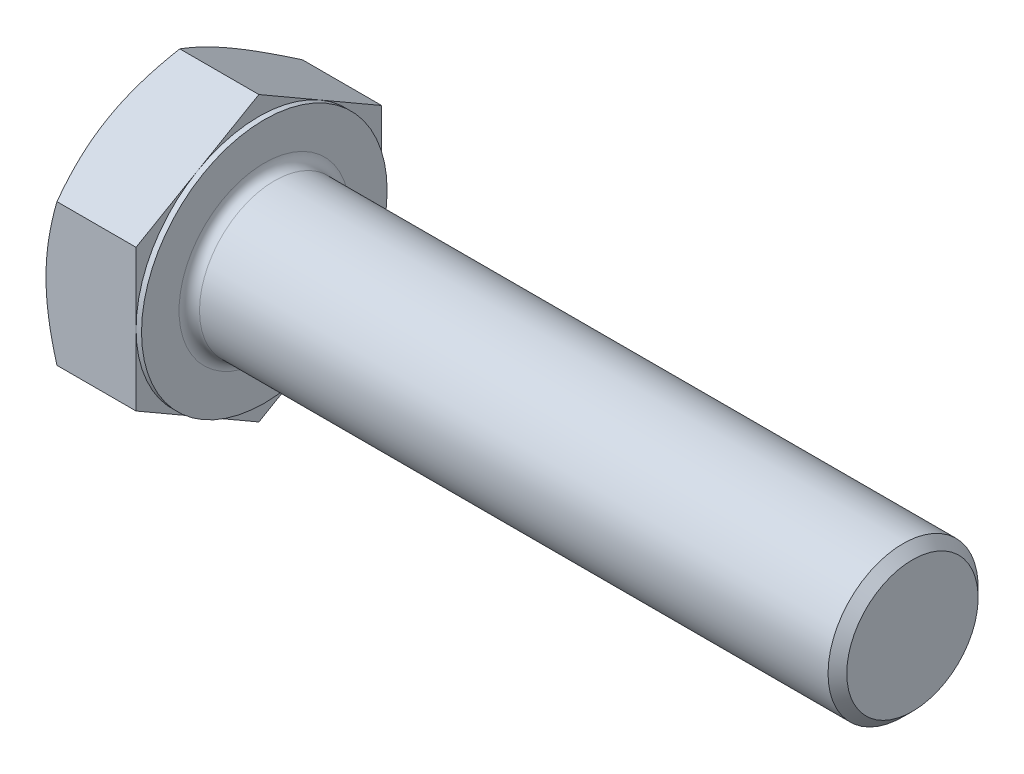
ISO-10303-21;
HEADER;
FILE_DESCRIPTION(('STEP AP214'),'2;1');
FILE_NAME('part.step','',(''),(''),'','','');
FILE_SCHEMA(('AUTOMOTIVE_DESIGN { 1 0 10303 214 1 1 1 1 }'));
ENDSEC;
DATA;
#1=APPLICATION_CONTEXT('core data for automotive mechanical design processes');
#2=APPLICATION_PROTOCOL_DEFINITION('international standard','automotive_design',2000,#1);
#3=PRODUCT_CONTEXT('',#1,'mechanical');
#4=PRODUCT('Part','Part','',(#3));
#5=PRODUCT_RELATED_PRODUCT_CATEGORY('part','',(#4));
#6=PRODUCT_DEFINITION_FORMATION('','',#4);
#7=PRODUCT_DEFINITION_CONTEXT('part definition',#1,'design');
#8=PRODUCT_DEFINITION('design','',#6,#7);
#9=PRODUCT_DEFINITION_SHAPE('','',#8);
#10=(LENGTH_UNIT() NAMED_UNIT(*) SI_UNIT(.MILLI.,.METRE.));
#11=(NAMED_UNIT(*) PLANE_ANGLE_UNIT() SI_UNIT($,.RADIAN.));
#12=(NAMED_UNIT(*) SI_UNIT($,.STERADIAN.) SOLID_ANGLE_UNIT());
#13=UNCERTAINTY_MEASURE_WITH_UNIT(LENGTH_MEASURE(1.E-05),#10,'distance_accuracy_value','');
#14=(GEOMETRIC_REPRESENTATION_CONTEXT(3) GLOBAL_UNCERTAINTY_ASSIGNED_CONTEXT((#13)) GLOBAL_UNIT_ASSIGNED_CONTEXT((#10,
#11,#12)) REPRESENTATION_CONTEXT('',''));
#15=CARTESIAN_POINT('',(0.,0.,0.));
#16=DIRECTION('',(0.,0.,1.));
#17=DIRECTION('',(1.,0.,0.));
#18=AXIS2_PLACEMENT_3D('',#15,#16,#17);
#19=CARTESIAN_POINT('',(14.,20.7846096908265,0.));
#20=DIRECTION('',(1.,0.,0.));
#21=DIRECTION('',(0.,0.,-1.));
#22=AXIS2_PLACEMENT_3D('',#19,#20,#21);
#23=PLANE('',#22);
#24=CARTESIAN_POINT('',(14.,0.,0.));
#25=DIRECTION('',(1.,0.,0.));
#26=DIRECTION('',(0.,0.,-1.));
#27=AXIS2_PLACEMENT_3D('',#24,#25,#26);
#28=CIRCLE('',#27,12.5);
#29=CARTESIAN_POINT('',(14.,0.,-12.5));
#30=VERTEX_POINT('',#29);
#31=EDGE_CURVE('E43',#30,#30,#28,.F.);
#32=ORIENTED_EDGE('',*,*,#31,.T.);
#33=EDGE_LOOP('',(#32));
#34=FACE_BOUND('',#33,.T.);
#35=CARTESIAN_POINT('',(14.,0.,0.));
#36=DIRECTION('',(1.,0.,0.));
#37=DIRECTION('',(0.,0.,-1.));
#38=AXIS2_PLACEMENT_3D('',#35,#36,#37);
#39=CIRCLE('',#38,18.);
#40=CARTESIAN_POINT('',(14.,0.,-18.));
#41=VERTEX_POINT('',#40);
#42=EDGE_CURVE('E294',#41,#41,#39,.T.);
#43=ORIENTED_EDGE('',*,*,#42,.T.);
#44=EDGE_LOOP('',(#43));
#45=FACE_BOUND('',#44,.T.);
#46=ADVANCED_FACE('F35',(#34,#45),#23,.T.);
#47=CARTESIAN_POINT('',(0.,0.,0.));
#48=DIRECTION('',(-1.,0.,0.));
#49=DIRECTION('',(0.,0.,1.));
#50=AXIS2_PLACEMENT_3D('',#47,#48,#49);
#51=CYLINDRICAL_SURFACE('',#50,11.);
#52=CARTESIAN_POINT('',(15.5,0.,0.));
#53=DIRECTION('',(1.,0.,0.));
#54=DIRECTION('',(0.,0.,-1.));
#55=AXIS2_PLACEMENT_3D('',#52,#53,#54);
#56=CIRCLE('',#55,11.);
#57=CARTESIAN_POINT('',(15.5,0.,-11.));
#58=VERTEX_POINT('',#57);
#59=EDGE_CURVE('E11',#58,#58,#56,.T.);
#60=ORIENTED_EDGE('',*,*,#59,.T.);
#61=EDGE_LOOP('',(#60));
#62=FACE_BOUND('',#61,.T.);
#63=CARTESIAN_POINT('',(107.626,0.,0.));
#64=DIRECTION('',(-1.,0.,0.));
#65=DIRECTION('',(0.,0.,1.));
#66=AXIS2_PLACEMENT_3D('',#63,#64,#65);
#67=CIRCLE('',#66,11.);
#68=CARTESIAN_POINT('',(107.626,0.,11.));
#69=VERTEX_POINT('',#68);
#70=EDGE_CURVE('E273',#69,#69,#67,.T.);
#71=ORIENTED_EDGE('',*,*,#70,.T.);
#72=EDGE_LOOP('',(#71));
#73=FACE_BOUND('',#72,.T.);
#74=ADVANCED_FACE('F247',(#62,#73),#51,.T.);
#75=CARTESIAN_POINT('',(109.,0.,0.));
#76=DIRECTION('',(-1.,0.,0.));
#77=DIRECTION('',(0.,0.,1.));
#78=AXIS2_PLACEMENT_3D('',#75,#76,#77);
#79=CONICAL_SURFACE('',#78,9.626,0.785398163397443);
#80=ORIENTED_EDGE('',*,*,#70,.F.);
#81=EDGE_LOOP('',(#80));
#82=FACE_BOUND('',#81,.T.);
#83=CARTESIAN_POINT('',(109.,0.,0.));
#84=DIRECTION('',(-1.,0.,0.));
#85=DIRECTION('',(0.,0.,1.));
#86=AXIS2_PLACEMENT_3D('',#83,#84,#85);
#87=CIRCLE('',#86,9.626);
#88=CARTESIAN_POINT('',(109.,0.,9.626));
#89=VERTEX_POINT('',#88);
#90=EDGE_CURVE('E271',#89,#89,#87,.T.);
#91=ORIENTED_EDGE('',*,*,#90,.T.);
#92=EDGE_LOOP('',(#91));
#93=FACE_BOUND('',#92,.T.);
#94=ADVANCED_FACE('F252',(#82,#93),#79,.T.);
#95=CARTESIAN_POINT('',(109.,0.,0.));
#96=DIRECTION('',(-1.,0.,0.));
#97=DIRECTION('',(0.,0.,1.));
#98=AXIS2_PLACEMENT_3D('',#95,#96,#97);
#99=PLANE('',#98);
#100=ORIENTED_EDGE('',*,*,#90,.F.);
#101=EDGE_LOOP('',(#100));
#102=FACE_BOUND('',#101,.T.);
#103=ADVANCED_FACE('F259',(#102),#99,.F.);
#104=CARTESIAN_POINT('',(13.2,18.,0.));
#105=DIRECTION('',(1.,0.,0.));
#106=DIRECTION('',(0.,0.,-1.));
#107=AXIS2_PLACEMENT_3D('',#104,#105,#106);
#108=PLANE('',#107);
#109=DIRECTION('',(0.,0.500000000000001,0.866025403784438));
#110=VECTOR('',#109,1.);
#111=CARTESIAN_POINT('',(13.2,10.3923048454132,-18.));
#112=LINE('',#111,#110);
#113=CARTESIAN_POINT('',(13.2,10.3923048454132,-18.));
#114=VERTEX_POINT('',#113);
#115=CARTESIAN_POINT('',(13.2,15.5884572681199,-9.00000000000002));
#116=VERTEX_POINT('',#115);
#117=EDGE_CURVE('E167',#114,#116,#112,.T.);
#118=ORIENTED_EDGE('',*,*,#117,.T.);
#119=CARTESIAN_POINT('',(13.2,0.,0.));
#120=DIRECTION('',(-1.,0.,0.));
#121=DIRECTION('',(0.,0.,1.));
#122=AXIS2_PLACEMENT_3D('',#119,#120,#121);
#123=CIRCLE('',#122,18.);
#124=CARTESIAN_POINT('',(13.2,0.,-18.));
#125=VERTEX_POINT('',#124);
#126=EDGE_CURVE('E50',#116,#125,#123,.T.);
#127=ORIENTED_EDGE('',*,*,#126,.T.);
#128=DIRECTION('',(0.,1.,0.));
#129=VECTOR('',#128,1.);
#130=CARTESIAN_POINT('',(13.2,10.3923048454132,-18.));
#131=LINE('',#130,#129);
#132=EDGE_CURVE('E297',#125,#114,#131,.T.);
#133=ORIENTED_EDGE('',*,*,#132,.T.);
#134=EDGE_LOOP('',(#118,#127,#133));
#135=FACE_BOUND('',#134,.T.);
#136=ADVANCED_FACE('F262',(#135),#108,.T.);
#137=CARTESIAN_POINT('',(13.2,20.7846096908265,0.));
#138=VERTEX_POINT('',#137);
#139=EDGE_CURVE('E165',#116,#138,#112,.T.);
#140=ORIENTED_EDGE('',*,*,#139,.T.);
#141=DIRECTION('',(0.,-0.500000000000001,0.866025403784438));
#142=VECTOR('',#141,1.);
#143=CARTESIAN_POINT('',(13.2,20.7846096908265,0.));
#144=LINE('',#143,#142);
#145=CARTESIAN_POINT('',(13.2,15.5884572681199,9.00000000000002));
#146=VERTEX_POINT('',#145);
#147=EDGE_CURVE('E164',#138,#146,#144,.T.);
#148=ORIENTED_EDGE('',*,*,#147,.T.);
#149=EDGE_CURVE('E153',#146,#116,#123,.T.);
#150=ORIENTED_EDGE('',*,*,#149,.T.);
#151=EDGE_LOOP('',(#140,#148,#150));
#152=FACE_BOUND('',#151,.T.);
#153=ADVANCED_FACE('F267',(#152),#108,.T.);
#154=CARTESIAN_POINT('',(13.2,10.3923048454132,18.));
#155=VERTEX_POINT('',#154);
#156=EDGE_CURVE('E132',#146,#155,#144,.T.);
#157=ORIENTED_EDGE('',*,*,#156,.T.);
#158=DIRECTION('',(0.,-1.,0.));
#159=VECTOR('',#158,1.);
#160=CARTESIAN_POINT('',(13.2,10.3923048454132,18.));
#161=LINE('',#160,#159);
#162=CARTESIAN_POINT('',(13.2,0.,18.));
#163=VERTEX_POINT('',#162);
#164=EDGE_CURVE('E126',#155,#163,#161,.T.);
#165=ORIENTED_EDGE('',*,*,#164,.T.);
#166=EDGE_CURVE('E130',#163,#146,#123,.T.);
#167=ORIENTED_EDGE('',*,*,#166,.T.);
#168=EDGE_LOOP('',(#157,#165,#167));
#169=FACE_BOUND('',#168,.T.);
#170=ADVANCED_FACE('F128',(#169),#108,.T.);
#171=CARTESIAN_POINT('',(13.2,-10.3923048454132,18.));
#172=VERTEX_POINT('',#171);
#173=EDGE_CURVE('E136',#163,#172,#161,.T.);
#174=ORIENTED_EDGE('',*,*,#173,.T.);
#175=DIRECTION('',(0.,-0.500000000000002,-0.866025403784438));
#176=VECTOR('',#175,1.);
#177=CARTESIAN_POINT('',(13.2,-20.7846096908265,0.));
#178=LINE('',#177,#176);
#179=CARTESIAN_POINT('',(13.2,-15.5884572681199,9.00000000000004));
#180=VERTEX_POINT('',#179);
#181=EDGE_CURVE('E143',#172,#180,#178,.T.);
#182=ORIENTED_EDGE('',*,*,#181,.T.);
#183=EDGE_CURVE('E140',#180,#163,#123,.T.);
#184=ORIENTED_EDGE('',*,*,#183,.T.);
#185=EDGE_LOOP('',(#174,#182,#184));
#186=FACE_BOUND('',#185,.T.);
#187=ADVANCED_FACE('F141',(#186),#108,.T.);
#188=CARTESIAN_POINT('',(13.2,-20.7846096908265,0.));
#189=VERTEX_POINT('',#188);
#190=EDGE_CURVE('E159',#180,#189,#178,.T.);
#191=ORIENTED_EDGE('',*,*,#190,.T.);
#192=DIRECTION('',(0.,0.499999999999999,-0.866025403784439));
#193=VECTOR('',#192,1.);
#194=CARTESIAN_POINT('',(13.2,-10.3923048454133,-18.));
#195=LINE('',#194,#193);
#196=CARTESIAN_POINT('',(13.2,-15.5884572681199,-8.99999999999999));
#197=VERTEX_POINT('',#196);
#198=EDGE_CURVE('E335',#189,#197,#195,.T.);
#199=ORIENTED_EDGE('',*,*,#198,.T.);
#200=EDGE_CURVE('E147',#197,#180,#123,.T.);
#201=ORIENTED_EDGE('',*,*,#200,.T.);
#202=EDGE_LOOP('',(#191,#199,#201));
#203=FACE_BOUND('',#202,.T.);
#204=ADVANCED_FACE('F336',(#203),#108,.T.);
#205=CARTESIAN_POINT('',(13.2,-10.3923048454133,-18.));
#206=VERTEX_POINT('',#205);
#207=EDGE_CURVE('E154',#197,#206,#195,.T.);
#208=ORIENTED_EDGE('',*,*,#207,.T.);
#209=EDGE_CURVE('E298',#206,#125,#131,.T.);
#210=ORIENTED_EDGE('',*,*,#209,.T.);
#211=EDGE_CURVE('E305',#125,#197,#123,.T.);
#212=ORIENTED_EDGE('',*,*,#211,.T.);
#213=EDGE_LOOP('',(#208,#210,#212));
#214=FACE_BOUND('',#213,.T.);
#215=ADVANCED_FACE('F268',(#214),#108,.T.);
#216=CARTESIAN_POINT('',(0.,0.,0.));
#217=DIRECTION('',(-1.,0.,0.));
#218=DIRECTION('',(0.,0.,1.));
#219=AXIS2_PLACEMENT_3D('',#216,#217,#218);
#220=CYLINDRICAL_SURFACE('',#219,18.);
#221=ORIENTED_EDGE('',*,*,#126,.F.);
#222=ORIENTED_EDGE('',*,*,#149,.F.);
#223=ORIENTED_EDGE('',*,*,#166,.F.);
#224=ORIENTED_EDGE('',*,*,#183,.F.);
#225=ORIENTED_EDGE('',*,*,#200,.F.);
#226=ORIENTED_EDGE('',*,*,#211,.F.);
#227=EDGE_LOOP('',(#221,#222,#223,#224,#225,#226));
#228=FACE_BOUND('',#227,.T.);
#229=ORIENTED_EDGE('',*,*,#42,.F.);
#230=EDGE_LOOP('',(#229));
#231=FACE_BOUND('',#230,.T.);
#232=ADVANCED_FACE('F150',(#228,#231),#220,.T.);
#233=CARTESIAN_POINT('',(0.,20.7846096908265,0.));
#234=DIRECTION('',(1.,0.,0.));
#235=DIRECTION('',(0.,0.,-1.));
#236=AXIS2_PLACEMENT_3D('',#233,#234,#235);
#237=PLANE('',#236);
#238=CARTESIAN_POINT('',(0.,0.,0.));
#239=DIRECTION('',(1.,0.,0.));
#240=DIRECTION('',(0.,0.,-1.));
#241=AXIS2_PLACEMENT_3D('',#238,#239,#240);
#242=CIRCLE('',#241,18.);
#243=CARTESIAN_POINT('',(0.,0.,-18.));
#244=VERTEX_POINT('',#243);
#245=CARTESIAN_POINT('',(0.,15.5884572681199,-9.00000000000002));
#246=VERTEX_POINT('',#245);
#247=EDGE_CURVE('E293',#244,#246,#242,.T.);
#248=ORIENTED_EDGE('',*,*,#247,.F.);
#249=CARTESIAN_POINT('',(0.,-15.5884572681199,-8.99999999999999));
#250=VERTEX_POINT('',#249);
#251=EDGE_CURVE('E289',#250,#244,#242,.T.);
#252=ORIENTED_EDGE('',*,*,#251,.F.);
#253=CARTESIAN_POINT('',(0.,-15.5884572681199,9.00000000000004));
#254=VERTEX_POINT('',#253);
#255=EDGE_CURVE('E292',#254,#250,#242,.T.);
#256=ORIENTED_EDGE('',*,*,#255,.F.);
#257=CARTESIAN_POINT('',(0.,0.,18.));
#258=VERTEX_POINT('',#257);
#259=EDGE_CURVE('E328',#258,#254,#242,.T.);
#260=ORIENTED_EDGE('',*,*,#259,.F.);
#261=CARTESIAN_POINT('',(0.,0.,0.));
#262=DIRECTION('',(-1.,0.,0.));
#263=DIRECTION('',(0.,0.,1.));
#264=AXIS2_PLACEMENT_3D('',#261,#262,#263);
#265=CIRCLE('',#264,18.);
#266=CARTESIAN_POINT('',(0.,15.5884572681199,9.00000000000002));
#267=VERTEX_POINT('',#266);
#268=EDGE_CURVE('E168',#258,#267,#265,.T.);
#269=ORIENTED_EDGE('',*,*,#268,.T.);
#270=EDGE_CURVE('E351',#246,#267,#242,.T.);
#271=ORIENTED_EDGE('',*,*,#270,.F.);
#272=EDGE_LOOP('',(#248,#252,#256,#260,#269,#271));
#273=FACE_BOUND('',#272,.T.);
#274=ADVANCED_FACE('F197',(#273),#237,.F.);
#275=CARTESIAN_POINT('',(0.,0.,0.));
#276=DIRECTION('',(1.,0.,0.));
#277=DIRECTION('',(0.,0.,-1.));
#278=AXIS2_PLACEMENT_3D('',#275,#276,#277);
#279=CONICAL_SURFACE('',#278,18.,1.0471975511966);
#280=CARTESIAN_POINT('',(1.60776182180894,10.3921893753594,18.0002));
#281=CARTESIAN_POINT('',(1.47589336556312,10.6206079566545,17.6045674118041));
#282=CARTESIAN_POINT('',(1.35000889021179,10.8499174930169,17.2073916441644));
#283=CARTESIAN_POINT('',(1.11187123611098,11.310375356009,16.4098552307175));
#284=CARTESIAN_POINT('',(0.999622540659328,11.5415242609305,16.0094935832795));
#285=CARTESIAN_POINT('',(0.790265297583965,12.0061075993295,15.2048116368225));
#286=CARTESIAN_POINT('',(0.693192573141012,12.2395460983593,14.8004842960602));
#287=CARTESIAN_POINT('',(0.516271743787661,12.7080451523823,13.9890201311945));
#288=CARTESIAN_POINT('',(0.436422652420739,12.9431056136839,13.5818834693696));
#289=CARTESIAN_POINT('',(0.297345302854856,13.4088255484441,12.7752328802672));
#290=CARTESIAN_POINT('',(0.237656723113624,13.6394504469968,12.3757788384836));
#291=CARTESIAN_POINT('',(0.137572375669446,14.1017570002651,11.5750403995507));
#292=CARTESIAN_POINT('',(0.0971769793251332,14.3334386752352,11.1737559673198));
#293=CARTESIAN_POINT('',(0.0366989588175625,14.7971912077607,10.3705130188471));
#294=CARTESIAN_POINT('',(0.0165921970388511,15.0292612730516,9.96855587484738));
#295=CARTESIAN_POINT('',(-0.00287614600259025,15.4936156120144,9.16427056704863));
#296=CARTESIAN_POINT('',(-0.00223836829112602,15.7258998788456,8.76194241509822));
#297=CARTESIAN_POINT('',(0.018333579496379,16.1601606713826,8.0097806586889));
#298=CARTESIAN_POINT('',(0.0357591844006479,16.3621681381522,7.65989346273578));
#299=CARTESIAN_POINT('',(0.0859690685012191,16.765701206145,6.96095368643809));
#300=CARTESIAN_POINT('',(0.11875312773627,16.9672268142278,6.61190109421243));
#301=CARTESIAN_POINT('',(0.199111057578682,17.3697198122039,5.91476277202716));
#302=CARTESIAN_POINT('',(0.246698302564828,17.5706865308241,5.56667820474647));
#303=CARTESIAN_POINT('',(0.355822876567441,17.9716632799777,4.87216610255867));
#304=CARTESIAN_POINT('',(0.417360146472634,18.1716733145612,4.52573856063651));
#305=CARTESIAN_POINT('',(0.624462075708563,18.7788295665707,3.47411308402299));
#306=CARTESIAN_POINT('',(0.790677467933146,19.1842175215698,2.77196054918801));
#307=CARTESIAN_POINT('',(1.1679181702988,19.9889486858692,1.37812528618742));
#308=CARTESIAN_POINT('',(1.3788548871277,20.3883021980098,0.686424712978884));
#309=CARTESIAN_POINT('',(1.60776182180895,20.7847251608804,-0.000200000000000849));
#310=B_SPLINE_CURVE_WITH_KNOTS('',3,(#280,#281,#282,#283,#284,#285,#286,#287,#288,#289,#290,
#291,#292,#293,#294,#295,#296,#297,#298,#299,#300,#301,#302,#303,#304,#305,#306,#307,#308,#309),
.UNSPECIFIED.,.F.,.F.,(4,2,2,2,2,2,2,2,2,2,2,2,2,2,4),(0.,1.42650335783821,2.85347447244912,
4.28376471280638,5.71397301377358,7.10888071673008,8.50381526803681,9.8970882864255,
11.2903182514068,12.5031974791544,13.7160593367768,14.9300201888636,16.1439758970578,
18.6253607678546,21.1018751738865),.UNSPECIFIED.);
#311=CARTESIAN_POINT('',(1.60769515458674,20.7846096908265,0.));
#312=VERTEX_POINT('',#311);
#313=EDGE_CURVE('E216',#267,#312,#310,.T.);
#314=ORIENTED_EDGE('',*,*,#313,.T.);
#315=CARTESIAN_POINT('',(1.60776182180895,20.7847251608804,0.0002));
#316=CARTESIAN_POINT('',(1.47589336556313,20.5563065795853,-0.395432588195889));
#317=CARTESIAN_POINT('',(1.3500088902118,20.3269970432229,-0.792608355835561));
#318=CARTESIAN_POINT('',(1.11187123611099,19.8665391802308,-1.59014476928247));
#319=CARTESIAN_POINT('',(0.999622540659336,19.6353902753093,-1.99050641672051));
#320=CARTESIAN_POINT('',(0.790265297583971,19.1708069369103,-2.79518836317755));
#321=CARTESIAN_POINT('',(0.693192573141017,18.9373684378805,-3.19951570393978));
#322=CARTESIAN_POINT('',(0.516271743787666,18.4688693838575,-4.01097986880547));
#323=CARTESIAN_POINT('',(0.436422652420744,18.2338089225559,-4.41811653063042));
#324=CARTESIAN_POINT('',(0.29734530285486,17.7680889877957,-5.22476711973284));
#325=CARTESIAN_POINT('',(0.237656723113627,17.537464089243,-5.62422116151642));
#326=CARTESIAN_POINT('',(0.137572375669448,17.0751575359747,-6.42495960044929));
#327=CARTESIAN_POINT('',(0.0971769793251362,16.8434758610046,-6.82624403268018));
#328=CARTESIAN_POINT('',(0.0366989588175645,16.3797233284791,-7.62948698115295));
#329=CARTESIAN_POINT('',(0.0165921970388512,16.1476532631882,-8.03144412515262));
#330=CARTESIAN_POINT('',(-0.00287614600259242,15.6832989242254,-8.83572943295137));
#331=CARTESIAN_POINT('',(-0.0022383682911285,15.4510146573942,-9.23805758490179));
#332=CARTESIAN_POINT('',(0.0183335794963755,15.0167538648571,-9.99021934131111));
#333=CARTESIAN_POINT('',(0.0357591844006437,14.8147463980876,-10.3401065372642));
#334=CARTESIAN_POINT('',(0.0859690685012138,14.4112133300948,-11.0390463135619));
#335=CARTESIAN_POINT('',(0.118753127736264,14.209687722012,-11.3880989057876));
#336=CARTESIAN_POINT('',(0.199111057578676,13.8071947240359,-12.0852372279728));
#337=CARTESIAN_POINT('',(0.246698302564822,13.6062280054156,-12.4333217952535));
#338=CARTESIAN_POINT('',(0.355822876567433,13.2052512562621,-13.1278338974413));
#339=CARTESIAN_POINT('',(0.417360146472624,13.0052412216786,-13.4742614393635));
#340=CARTESIAN_POINT('',(0.62446207570855,12.3980849696691,-14.525886915977));
#341=CARTESIAN_POINT('',(0.790677467933133,11.99269701467,-15.228039450812));
#342=CARTESIAN_POINT('',(1.16791817029879,11.1879658503706,-16.6218747138126));
#343=CARTESIAN_POINT('',(1.37885488712769,10.78861233823,-17.3135752870211));
#344=CARTESIAN_POINT('',(1.60776182180894,10.3921893753594,-18.0002));
#345=B_SPLINE_CURVE_WITH_KNOTS('',3,(#315,#316,#317,#318,#319,#320,#321,#322,#323,#324,#325,
#326,#327,#328,#329,#330,#331,#332,#333,#334,#335,#336,#337,#338,#339,#340,#341,#342,#343,#344),
.UNSPECIFIED.,.F.,.F.,(4,2,2,2,2,2,2,2,2,2,2,2,2,2,4),(0.,1.42650335783822,2.85347447244913,
4.28376471280638,5.71397301377359,7.10888071673009,8.50381526803682,9.89708828642551,
11.2903182514068,12.5031974791545,13.7160593367768,14.9300201888636,16.1439758970578,
18.6253607678546,21.1018751738864),.UNSPECIFIED.);
#346=EDGE_CURVE('E58',#312,#246,#345,.T.);
#347=ORIENTED_EDGE('',*,*,#346,.T.);
#348=ORIENTED_EDGE('',*,*,#270,.T.);
#349=EDGE_LOOP('',(#314,#347,#348));
#350=FACE_BOUND('',#349,.T.);
#351=ADVANCED_FACE('F352',(#350),#279,.T.);
#352=CARTESIAN_POINT('',(8.808427130496,-27.9643402431046,18.));
#353=CARTESIAN_POINT('',(8.61750677802229,-27.5710662073959,18.));
#354=CARTESIAN_POINT('',(8.42753472732277,-27.1773320233033,18.));
#355=CARTESIAN_POINT('',(8.04970189891834,-26.3888473520457,18.));
#356=CARTESIAN_POINT('',(7.86184114230335,-25.9940968547769,18.));
#357=CARTESIAN_POINT('',(7.30169863346518,-24.8080724634241,18.));
#358=CARTESIAN_POINT('',(6.93291289399546,-24.0151412252697,18.));
#359=CARTESIAN_POINT('',(6.20490967153255,-22.4196974027513,18.));
#360=CARTESIAN_POINT('',(5.84575478283092,-21.6171561882138,18.));
#361=CARTESIAN_POINT('',(5.14207064659813,-20.0057089274192,18.));
#362=CARTESIAN_POINT('',(4.79754071148436,-19.1968031825104,18.));
#363=CARTESIAN_POINT('',(4.11611022257428,-17.5450041866493,18.));
#364=CARTESIAN_POINT('',(3.77981809482908,-16.7018586270337,18.));
#365=CARTESIAN_POINT('',(3.13256514784992,-15.0057154320914,18.));
#366=CARTESIAN_POINT('',(2.82160716489196,-14.1527167058291,18.));
#367=CARTESIAN_POINT('',(2.23315455016407,-12.43711867356,18.));
#368=CARTESIAN_POINT('',(1.95559259436132,-11.5745426460692,18.));
#369=CARTESIAN_POINT('',(1.44279031196762,-9.83693542713533,18.));
#370=CARTESIAN_POINT('',(1.20753670684013,-8.96190823687534,18.));
#371=CARTESIAN_POINT('',(0.895522308058547,-7.64230427801031,18.));
#372=CARTESIAN_POINT('',(0.798539960307994,-7.20248011867894,18.));
#373=CARTESIAN_POINT('',(0.619346663979907,-6.31981731439131,18.));
#374=CARTESIAN_POINT('',(0.537135413912318,-5.87697873115341,18.));
#375=CARTESIAN_POINT('',(0.388933808123908,-4.98859702789481,18.));
#376=CARTESIAN_POINT('',(0.322942911246026,-4.54305399861044,18.));
#377=CARTESIAN_POINT('',(0.208492383577686,-3.64970631100974,18.));
#378=CARTESIAN_POINT('',(0.160032741349874,-3.20190165416907,18.));
#379=CARTESIAN_POINT('',(0.0822220075298154,-2.31054962941569,18.));
#380=CARTESIAN_POINT('',(0.0526283717185093,-1.86702356479735,18.));
#381=CARTESIAN_POINT('',(0.0122265392151963,-0.979118128922007,18.));
#382=CARTESIAN_POINT('',(0.00141802963593451,-0.534738772000965,18.));
#383=CARTESIAN_POINT('',(-0.0011563176208092,0.354079706847762,18.));
#384=CARTESIAN_POINT('',(0.00707792061225407,0.798518829006629,18.));
#385=CARTESIAN_POINT('',(0.0423876675323166,1.68665283494853,18.));
#386=CARTESIAN_POINT('',(0.0694640211301642,2.13034768446279,18.));
#387=CARTESIAN_POINT('',(0.15648209292635,3.19520589070313,18.));
#388=CARTESIAN_POINT('',(0.225281528377598,3.81565824171457,18.));
#389=CARTESIAN_POINT('',(0.395990058380339,5.05199420564999,18.));
#390=CARTESIAN_POINT('',(0.497903614582592,5.66787719147407,18.));
#391=CARTESIAN_POINT('',(0.731215030304269,6.89447554273954,18.));
#392=CARTESIAN_POINT('',(0.862635769426441,7.50518651446563,18.));
#393=CARTESIAN_POINT('',(1.15094813703739,8.72049972355145,18.));
#394=CARTESIAN_POINT('',(1.30783938943284,9.32510205097041,18.));
#395=CARTESIAN_POINT('',(1.64698004778297,10.5414936469055,18.));
#396=CARTESIAN_POINT('',(1.82971241990763,11.1531473228725,18.));
#397=CARTESIAN_POINT('',(2.21414736076856,12.3704299751548,18.));
#398=CARTESIAN_POINT('',(2.41585005430055,12.9760589118076,18.));
#399=CARTESIAN_POINT('',(2.83501520647244,14.18158951787,18.));
#400=CARTESIAN_POINT('',(3.05247247513774,14.7814930003558,18.));
#401=CARTESIAN_POINT('',(3.50057968346487,15.9763233426994,18.));
#402=CARTESIAN_POINT('',(3.73122947137529,16.5712502597116,18.));
#403=CARTESIAN_POINT('',(4.28861115018067,17.9702204857275,18.));
#404=CARTESIAN_POINT('',(4.62002515649326,18.7723954680034,18.));
#405=CARTESIAN_POINT('',(5.29890820133678,20.3699430824084,18.));
#406=CARTESIAN_POINT('',(5.6463782233019,21.1653152943209,18.));
#407=CARTESIAN_POINT('',(6.35417286629494,22.750516727541,18.));
#408=CARTESIAN_POINT('',(6.71450033410772,23.5403446743747,18.));
#409=CARTESIAN_POINT('',(7.44542750445923,25.1152008413773,18.));
#410=CARTESIAN_POINT('',(7.8160269891661,25.9002291628984,18.));
#411=CARTESIAN_POINT('',(8.5659942861388,27.4671332618931,18.));
#412=CARTESIAN_POINT('',(8.94537123353964,28.2490046594181,18.));
#413=CARTESIAN_POINT('',(9.7110079736235,29.8093695492503,18.));
#414=CARTESIAN_POINT('',(10.0972677957068,30.5878630271109,18.));
#415=CARTESIAN_POINT('',(10.8754456131813,32.1418914548454,18.));
#416=CARTESIAN_POINT('',(11.2673628909044,32.9174267644654,18.));
#417=CARTESIAN_POINT('',(12.0559785801666,34.4660583569055,18.));
#418=CARTESIAN_POINT('',(12.4526769828552,35.2391546442373,18.));
#419=CARTESIAN_POINT('',(13.5822142013126,37.4263866617491,18.));
#420=CARTESIAN_POINT('',(14.3197969559458,38.8380724746762,18.));
#421=CARTESIAN_POINT('',(15.8050655327946,41.6561700073893,18.));
#422=CARTESIAN_POINT('',(16.5527517104898,43.0625815393687,18.));
#423=CARTESIAN_POINT('',(18.0539928572742,45.8677641350797,18.));
#424=CARTESIAN_POINT('',(18.8075285851389,47.2665455031668,18.));
#425=CARTESIAN_POINT('',(19.942334530836,49.3622270652889,18.));
#426=CARTESIAN_POINT('',(20.3213432724281,50.0603536788783,18.));
#427=CARTESIAN_POINT('',(21.0807116459902,51.4558704710998,18.));
#428=CARTESIAN_POINT('',(21.4610712758458,52.1532606508822,18.));
#429=CARTESIAN_POINT('',(21.8420286714726,52.850324235841,18.));
#430=B_SPLINE_CURVE_WITH_KNOTS('',3,(#352,#353,#354,#355,#356,#357,#358,#359,#360,#361,#362,
#363,#364,#365,#366,#367,#368,#369,#370,#371,#372,#373,#374,#375,#376,#377,#378,#379,#380,#381,
#382,#383,#384,#385,#386,#387,#388,#389,#390,#391,#392,#393,#394,#395,#396,#397,#398,#399,#400,
#401,#402,#403,#404,#405,#406,#407,#408,#409,#410,#411,#412,#413,#414,#415,#416,#417,#418,#419,
#420,#421,#422,#423,#424,#425,#426,#427,#428,#429),.UNSPECIFIED.,.F.,.F.,(4,2,2,2,2,2,2,2,2,2,2,
2,2,2,2,2,2,2,2,2,2,2,2,2,2,2,2,2,2,2,2,2,2,2,2,2,2,2,4),(0.,1.31149885283058,2.62301079472824,
5.24642021614437,7.88402931842206,10.5215142775822,13.2444150325257,15.9676202112372,
18.6852401997085,21.402005765065,22.7529669019192,24.1039004614305,25.4547889438409,
26.8056765449329,28.1388267463276,29.4719547424042,30.8050880527688,32.138281146834,
34.0100119547707,35.8819950561187,37.7554347199952,39.628846723491,41.5435776020438,
43.4583210774805,45.3724366289069,47.286530166998,49.890113594,52.4938567029427,
55.0981799317037,57.7024479744958,60.3095605480867,62.9166842606505,65.5234801070603,
68.1302711287376,72.908489911859,77.6868772522354,82.4533702914907,84.8364880602421,
87.2196021009334),.UNSPECIFIED.);
#431=CARTESIAN_POINT('',(1.60769515458672,10.3923048454132,18.));
#432=VERTEX_POINT('',#431);
#433=EDGE_CURVE('E228',#258,#432,#430,.T.);
#434=ORIENTED_EDGE('',*,*,#433,.T.);
#435=EDGE_CURVE('E227',#432,#267,#310,.T.);
#436=ORIENTED_EDGE('',*,*,#435,.T.);
#437=ORIENTED_EDGE('',*,*,#268,.F.);
#438=EDGE_LOOP('',(#434,#436,#437));
#439=FACE_BOUND('',#438,.T.);
#440=ADVANCED_FACE('F322',(#439),#279,.T.);
#441=CARTESIAN_POINT('',(1.60769515458671,-10.3923048454132,18.));
#442=VERTEX_POINT('',#441);
#443=EDGE_CURVE('E274',#442,#258,#430,.T.);
#444=ORIENTED_EDGE('',*,*,#443,.T.);
#445=ORIENTED_EDGE('',*,*,#259,.T.);
#446=CARTESIAN_POINT('',(1.60776182180894,-20.7847251608804,-0.000200000000000067));
#447=CARTESIAN_POINT('',(1.47589336556312,-20.5563065795853,0.395432588195888));
#448=CARTESIAN_POINT('',(1.35000889021179,-20.3269970432229,0.792608355835559));
#449=CARTESIAN_POINT('',(1.11187123611097,-19.8665391802308,1.59014476928247));
#450=CARTESIAN_POINT('',(0.999622540659322,-19.6353902753092,1.99050641672051));
#451=CARTESIAN_POINT('',(0.790265297583957,-19.1708069369102,2.79518836317754));
#452=CARTESIAN_POINT('',(0.693192573141003,-18.9373684378804,3.19951570393978));
#453=CARTESIAN_POINT('',(0.516271743787652,-18.4688693838575,4.01097986880546));
#454=CARTESIAN_POINT('',(0.436422652420729,-18.2338089225559,4.41811653063042));
#455=CARTESIAN_POINT('',(0.297345302854844,-17.7680889877956,5.22476711973283));
#456=CARTESIAN_POINT('',(0.237656723113612,-17.537464089243,5.62422116151641));
#457=CARTESIAN_POINT('',(0.137572375669433,-17.0751575359746,6.42495960044928));
#458=CARTESIAN_POINT('',(0.0971769793251206,-16.8434758610045,6.82624403268017));
#459=CARTESIAN_POINT('',(0.0366989588175476,-16.3797233284791,7.62948698115294));
#460=CARTESIAN_POINT('',(0.0165921970388338,-16.1476532631882,8.03144412515261));
#461=CARTESIAN_POINT('',(-0.00287614600260905,-15.6832989242253,8.83572943295136));
#462=CARTESIAN_POINT('',(-0.00223836829114399,-15.4510146573942,9.23805758490177));
#463=CARTESIAN_POINT('',(0.018333579496361,-15.0167538648571,9.99021934131109));
#464=CARTESIAN_POINT('',(0.0357591844006292,-14.8147463980876,10.3401065372642));
#465=CARTESIAN_POINT('',(0.0859690685011982,-14.4112133300948,11.0390463135619));
#466=CARTESIAN_POINT('',(0.118753127736247,-14.209687722012,11.3880989057876));
#467=CARTESIAN_POINT('',(0.199111057578658,-13.8071947240359,12.0852372279728));
#468=CARTESIAN_POINT('',(0.246698302564804,-13.6062280054156,12.4333217952535));
#469=CARTESIAN_POINT('',(0.355822876567417,-13.205251256262,13.1278338974413));
#470=CARTESIAN_POINT('',(0.417360146472609,-13.0052412216786,13.4742614393635));
#471=CARTESIAN_POINT('',(0.624462075708536,-12.3980849696691,14.525886915977));
#472=CARTESIAN_POINT('',(0.790677467933119,-11.9926970146699,15.228039450812));
#473=CARTESIAN_POINT('',(1.16791817029877,-11.1879658503705,16.6218747138126));
#474=CARTESIAN_POINT('',(1.37885488712767,-10.78861233823,17.3135752870211));
#475=CARTESIAN_POINT('',(1.60776182180893,-10.3921893753594,18.0002));
#476=B_SPLINE_CURVE_WITH_KNOTS('',3,(#446,#447,#448,#449,#450,#451,#452,#453,#454,#455,#456,
#457,#458,#459,#460,#461,#462,#463,#464,#465,#466,#467,#468,#469,#470,#471,#472,#473,#474,#475),
.UNSPECIFIED.,.F.,.F.,(4,2,2,2,2,2,2,2,2,2,2,2,2,2,4),(0.,1.42650335783821,2.85347447244913,
4.28376471280638,5.71397301377358,7.10888071673008,8.50381526803681,9.8970882864255,
11.2903182514067,12.5031974791544,13.7160593367768,14.9300201888636,16.1439758970578,
18.6253607678546,21.1018751738865),.UNSPECIFIED.);
#477=EDGE_CURVE('E218',#254,#442,#476,.T.);
#478=ORIENTED_EDGE('',*,*,#477,.T.);
#479=EDGE_LOOP('',(#444,#445,#478));
#480=FACE_BOUND('',#479,.T.);
#481=ADVANCED_FACE('F186',(#480),#279,.T.);
#482=CARTESIAN_POINT('',(1.60769515458672,-20.7846096908265,0.));
#483=VERTEX_POINT('',#482);
#484=EDGE_CURVE('E211',#483,#254,#476,.T.);
#485=ORIENTED_EDGE('',*,*,#484,.T.);
#486=ORIENTED_EDGE('',*,*,#255,.T.);
#487=CARTESIAN_POINT('',(1.60776182180895,-10.3921893753594,-18.0002));
#488=CARTESIAN_POINT('',(1.47589336556313,-10.6206079566545,-17.6045674118041));
#489=CARTESIAN_POINT('',(1.3500088902118,-10.8499174930169,-17.2073916441644));
#490=CARTESIAN_POINT('',(1.11187123611098,-11.310375356009,-16.4098552307175));
#491=CARTESIAN_POINT('',(0.999622540659333,-11.5415242609305,-16.0094935832795));
#492=CARTESIAN_POINT('',(0.790265297583968,-12.0061075993295,-15.2048116368225));
#493=CARTESIAN_POINT('',(0.693192573141014,-12.2395460983593,-14.8004842960602));
#494=CARTESIAN_POINT('',(0.516271743787664,-12.7080451523823,-13.9890201311945));
#495=CARTESIAN_POINT('',(0.436422652420743,-12.9431056136839,-13.5818834693696));
#496=CARTESIAN_POINT('',(0.29734530285486,-13.4088255484441,-12.7752328802672));
#497=CARTESIAN_POINT('',(0.237656723113627,-13.6394504469968,-12.3757788384836));
#498=CARTESIAN_POINT('',(0.137572375669448,-14.1017570002651,-11.5750403995507));
#499=CARTESIAN_POINT('',(0.0971769793251354,-14.3334386752353,-11.1737559673198));
#500=CARTESIAN_POINT('',(0.0366989588175634,-14.7971912077607,-10.370513018847));
#501=CARTESIAN_POINT('',(0.0165921970388502,-15.0292612730516,-9.96855587484736));
#502=CARTESIAN_POINT('',(-0.00287614600259132,-15.4936156120144,-9.16427056704861));
#503=CARTESIAN_POINT('',(-0.00223836829112545,-15.7258998788456,-8.7619424150982));
#504=CARTESIAN_POINT('',(0.0183335794963795,-16.1601606713826,-8.00978065868888));
#505=CARTESIAN_POINT('',(0.0357591844006469,-16.3621681381522,-7.65989346273576));
#506=CARTESIAN_POINT('',(0.0859690685012166,-16.765701206145,-6.96095368643808));
#507=CARTESIAN_POINT('',(0.118753127736267,-16.9672268142278,-6.61190109421241));
#508=CARTESIAN_POINT('',(0.19911105757868,-17.3697198122039,-5.91476277202715));
#509=CARTESIAN_POINT('',(0.246698302564826,-17.5706865308241,-5.56667820474646));
#510=CARTESIAN_POINT('',(0.355822876567437,-17.9716632799777,-4.87216610255866));
#511=CARTESIAN_POINT('',(0.417360146472628,-18.1716733145612,-4.5257385606365));
#512=CARTESIAN_POINT('',(0.624462075708553,-18.7788295665707,-3.47411308402298));
#513=CARTESIAN_POINT('',(0.790677467933135,-19.1842175215698,-2.77196054918801));
#514=CARTESIAN_POINT('',(1.16791817029879,-19.9889486858692,-1.37812528618742));
#515=CARTESIAN_POINT('',(1.37885488712769,-20.3883021980097,-0.686424712978881));
#516=CARTESIAN_POINT('',(1.60776182180894,-20.7847251608804,0.000200000000000986));
#517=B_SPLINE_CURVE_WITH_KNOTS('',3,(#487,#488,#489,#490,#491,#492,#493,#494,#495,#496,#497,
#498,#499,#500,#501,#502,#503,#504,#505,#506,#507,#508,#509,#510,#511,#512,#513,#514,#515,#516),
.UNSPECIFIED.,.F.,.F.,(4,2,2,2,2,2,2,2,2,2,2,2,2,2,4),(0.,1.42650335783821,2.85347447244913,
4.28376471280638,5.71397301377359,7.10888071673009,8.50381526803682,9.89708828642551,
11.2903182514068,12.5031974791544,13.7160593367767,14.9300201888636,16.1439758970578,
18.6253607678546,21.1018751738864),.UNSPECIFIED.);
#518=EDGE_CURVE('E217',#250,#483,#517,.T.);
#519=ORIENTED_EDGE('',*,*,#518,.T.);
#520=EDGE_LOOP('',(#485,#486,#519));
#521=FACE_BOUND('',#520,.T.);
#522=ADVANCED_FACE('F350',(#521),#279,.T.);
#523=CARTESIAN_POINT('',(1.60769515458672,10.3923048454132,-18.));
#524=VERTEX_POINT('',#523);
#525=EDGE_CURVE('E219',#246,#524,#345,.T.);
#526=ORIENTED_EDGE('',*,*,#525,.T.);
#527=CARTESIAN_POINT('',(8.80842713097472,-27.9643402440907,-18.));
#528=CARTESIAN_POINT('',(8.617506778491,-27.5710662083654,-18.));
#529=CARTESIAN_POINT('',(8.42753472778147,-27.1773320242562,-18.));
#530=CARTESIAN_POINT('',(8.04970189935704,-26.3888473529655,-18.));
#531=CARTESIAN_POINT('',(7.86184114273207,-25.9940968556801,-18.));
#532=CARTESIAN_POINT('',(7.30169863386396,-24.8080724642775,-18.));
#533=CARTESIAN_POINT('',(6.93291289437432,-24.0151412260899,-18.));
#534=CARTESIAN_POINT('',(6.20490967187157,-22.4196974035044,-18.));
#535=CARTESIAN_POINT('',(5.84575478315001,-21.6171561889331,-18.));
#536=CARTESIAN_POINT('',(5.14207064687771,-20.0057089280707,-18.));
#537=CARTESIAN_POINT('',(4.79754071174434,-19.196803183128,-18.));
#538=CARTESIAN_POINT('',(4.11611022279456,-17.5450041871963,-18.));
#539=CARTESIAN_POINT('',(3.7798180950293,-16.7018586275441,-18.));
#540=CARTESIAN_POINT('',(3.1325651480111,-15.005715432528,-18.));
#541=CARTESIAN_POINT('',(2.82160716503417,-14.1527167062286,-18.));
#542=CARTESIAN_POINT('',(2.23315455027017,-12.4371186738844,-18.));
#543=CARTESIAN_POINT('',(1.95559259445028,-11.5745426463558,-18.));
#544=CARTESIAN_POINT('',(1.44279031202514,-9.83693542734509,-18.));
#545=CARTESIAN_POINT('',(1.20753670688334,-8.96190823704618,-18.));
#546=CARTESIAN_POINT('',(0.895522308081283,-7.64230427811238,-18.));
#547=CARTESIAN_POINT('',(0.798539960323231,-7.20248011875152,-18.));
#548=CARTESIAN_POINT('',(0.619346663982092,-6.31981731440451,-18.));
#549=CARTESIAN_POINT('',(0.537135413908951,-5.87697873113672,-18.));
#550=CARTESIAN_POINT('',(0.388933808111682,-4.98859702781801,-18.));
#551=CARTESIAN_POINT('',(0.322942911230492,-4.54305399850342,-18.));
#552=CARTESIAN_POINT('',(0.208492383558027,-3.64970631084203,-18.));
#553=CARTESIAN_POINT('',(0.160032741329398,-3.2019016539709,-18.));
#554=CARTESIAN_POINT('',(0.0822220075103916,-2.31054962915723,-18.));
#555=CARTESIAN_POINT('',(0.0526283717009056,-1.86702356450905,-18.));
#556=CARTESIAN_POINT('',(0.0122265392038543,-0.97911812857412,-18.));
#557=CARTESIAN_POINT('',(0.0014180296290341,-0.53473877162332,-18.));
#558=CARTESIAN_POINT('',(-0.00115631761627054,0.354079707284696,-18.));
#559=CARTESIAN_POINT('',(0.00707792062379084,0.798518829473092,-18.));
#560=CARTESIAN_POINT('',(0.0423876675602103,1.68665283547366,-18.));
#561=CARTESIAN_POINT('',(0.0694640211674167,2.13034768501705,-18.));
#562=CARTESIAN_POINT('',(0.15648209298664,3.19520589130288,-18.));
#563=CARTESIAN_POINT('',(0.225281528451189,3.81565824233053,-18.));
#564=CARTESIAN_POINT('',(0.395990058481243,5.05199420629766,-18.));
#565=CARTESIAN_POINT('',(0.497903614697507,5.66787719213723,-18.));
#566=CARTESIAN_POINT('',(0.731215030447435,6.89447554343314,-18.));
#567=CARTESIAN_POINT('',(0.862635769583848,7.50518651517417,-18.));
#568=CARTESIAN_POINT('',(1.15094813722315,8.72049972428945,-18.));
#569=CARTESIAN_POINT('',(1.30783938963271,9.32510205172292,-18.));
#570=CARTESIAN_POINT('',(1.64698004801114,10.5414936476874,-18.));
#571=CARTESIAN_POINT('',(1.82971242014998,11.1531473236693,-18.));
#572=CARTESIAN_POINT('',(2.21414736103885,12.3704299759813,-18.));
#573=CARTESIAN_POINT('',(2.4158500545846,12.9760589126488,-18.));
#574=CARTESIAN_POINT('',(2.83501520678354,14.1815895187405,-18.));
#575=CARTESIAN_POINT('',(3.05247247546212,14.7814930012409,-18.));
#576=CARTESIAN_POINT('',(3.50057968381538,15.9763233436138,-18.));
#577=CARTESIAN_POINT('',(3.73122947173863,16.5712502606406,-18.));
#578=CARTESIAN_POINT('',(4.2886111505641,17.9702204866666,-18.));
#579=CARTESIAN_POINT('',(4.62002515688315,18.7723954689383,-18.));
#580=CARTESIAN_POINT('',(5.29890820173806,20.3699430833352,-18.));
#581=CARTESIAN_POINT('',(5.64637822370813,21.1653152952441,-18.));
#582=CARTESIAN_POINT('',(6.35417286670989,22.750516728457,-18.));
#583=CARTESIAN_POINT('',(6.71450033452645,23.5403446752873,-18.));
#584=CARTESIAN_POINT('',(7.44542750488466,25.1152008422835,-18.));
#585=CARTESIAN_POINT('',(7.81602698959444,25.9002291638016,-18.));
#586=CARTESIAN_POINT('',(8.56599428657223,27.4671332627904,-18.));
#587=CARTESIAN_POINT('',(8.94537123397525,28.2490046603126,-18.));
#588=CARTESIAN_POINT('',(9.71100797406293,29.8093695501392,-18.));
#589=CARTESIAN_POINT('',(10.0972677961478,30.5878630279972,-18.));
#590=CARTESIAN_POINT('',(10.8754456136253,32.1418914557266,-18.));
#591=CARTESIAN_POINT('',(11.2673628913496,32.9174267653441,-18.));
#592=CARTESIAN_POINT('',(12.0559785806139,34.4660583577795,-18.));
#593=CARTESIAN_POINT('',(12.4526769833034,35.239154645109,-18.));
#594=CARTESIAN_POINT('',(13.5822142017646,37.4263866626177,-18.));
#595=CARTESIAN_POINT('',(14.3197969564005,38.8380724755441,-18.));
#596=CARTESIAN_POINT('',(15.805065533254,41.656170008256,-18.));
#597=CARTESIAN_POINT('',(16.5527517109513,43.062581540235,-18.));
#598=CARTESIAN_POINT('',(18.0539928577398,45.8677641359459,-18.));
#599=CARTESIAN_POINT('',(18.8075285856065,47.2665455040333,-18.));
#600=CARTESIAN_POINT('',(19.9423345313063,49.362227066156,-18.));
#601=CARTESIAN_POINT('',(20.3213432728994,50.0603536797456,-18.));
#602=CARTESIAN_POINT('',(21.0807116464631,51.4558704719676,-18.));
#603=CARTESIAN_POINT('',(21.4610712763196,52.1532606517502,-18.));
#604=CARTESIAN_POINT('',(21.8420286719472,52.8503242367093,-18.));
#605=B_SPLINE_CURVE_WITH_KNOTS('',3,(#527,#528,#529,#530,#531,#532,#533,#534,#535,#536,#537,
#538,#539,#540,#541,#542,#543,#544,#545,#546,#547,#548,#549,#550,#551,#552,#553,#554,#555,#556,
#557,#558,#559,#560,#561,#562,#563,#564,#565,#566,#567,#568,#569,#570,#571,#572,#573,#574,#575,
#576,#577,#578,#579,#580,#581,#582,#583,#584,#585,#586,#587,#588,#589,#590,#591,#592,#593,#594,
#595,#596,#597,#598,#599,#600,#601,#602,#603,#604),.UNSPECIFIED.,.F.,.F.,(4,2,2,2,2,2,2,2,2,2,2,
2,2,2,2,2,2,2,2,2,2,2,2,2,2,2,2,2,2,2,2,2,2,2,2,2,2,2,4),(0.,1.31149885288839,2.62301079484386,
5.24642021637563,7.88402931877024,10.5215142780472,13.244415033115,15.9676202119508,
18.6852402005459,21.4020057660261,22.7529669029715,24.1039004625739,25.4547889450755,
26.8056765462585,28.138826747742,29.4719547439074,30.8050880543609,32.1382811485151,
34.0100119565044,35.8819950579051,37.7554347218344,39.6288467253831,41.5435776039908,
43.4583210794826,45.3724366309638,47.2865301691098,49.8901135961075,52.4938567050457,
55.0981799338023,57.70244797659,60.3095605501759,62.9166842627347,65.5234801091398,
68.1302711308122,72.9084899139354,77.6868772543135,82.4533702935725,84.8364880623258,
87.219602103019),.UNSPECIFIED.);
#606=EDGE_CURVE('E179',#524,#244,#605,.F.);
#607=ORIENTED_EDGE('',*,*,#606,.T.);
#608=ORIENTED_EDGE('',*,*,#247,.T.);
#609=EDGE_LOOP('',(#526,#607,#608));
#610=FACE_BOUND('',#609,.T.);
#611=ADVANCED_FACE('F347',(#610),#279,.T.);
#612=CARTESIAN_POINT('',(1.60769515458673,-10.3923048454133,-18.));
#613=VERTEX_POINT('',#612);
#614=EDGE_CURVE('E180',#613,#250,#517,.T.);
#615=ORIENTED_EDGE('',*,*,#614,.T.);
#616=ORIENTED_EDGE('',*,*,#251,.T.);
#617=EDGE_CURVE('E171',#244,#613,#605,.F.);
#618=ORIENTED_EDGE('',*,*,#617,.T.);
#619=EDGE_LOOP('',(#615,#616,#618));
#620=FACE_BOUND('',#619,.T.);
#621=ADVANCED_FACE('F195',(#620),#279,.T.);
#622=CARTESIAN_POINT('',(14.,10.3923048454132,-18.));
#623=DIRECTION('',(0.,0.,1.));
#624=DIRECTION('',(0.,-1.,0.));
#625=AXIS2_PLACEMENT_3D('',#622,#623,#624);
#626=PLANE('',#625);
#627=ORIENTED_EDGE('',*,*,#209,.F.);
#628=DIRECTION('',(-1.,0.,0.));
#629=VECTOR('',#628,1.);
#630=CARTESIAN_POINT('',(14.,-10.3923048454133,-18.));
#631=LINE('',#630,#629);
#632=EDGE_CURVE('E280',#206,#613,#631,.T.);
#633=ORIENTED_EDGE('',*,*,#632,.T.);
#634=ORIENTED_EDGE('',*,*,#617,.F.);
#635=ORIENTED_EDGE('',*,*,#606,.F.);
#636=DIRECTION('',(-1.,0.,0.));
#637=VECTOR('',#636,1.);
#638=CARTESIAN_POINT('',(14.,10.3923048454132,-18.));
#639=LINE('',#638,#637);
#640=EDGE_CURVE('E276',#114,#524,#639,.T.);
#641=ORIENTED_EDGE('',*,*,#640,.F.);
#642=ORIENTED_EDGE('',*,*,#132,.F.);
#643=EDGE_LOOP('',(#627,#633,#634,#635,#641,#642));
#644=FACE_BOUND('',#643,.T.);
#645=ADVANCED_FACE('F190',(#644),#626,.F.);
#646=CARTESIAN_POINT('',(14.,-10.3923048454133,-18.));
#647=DIRECTION('',(0.,0.866025403784439,0.499999999999999));
#648=DIRECTION('',(0.,-0.499999999999999,0.866025403784439));
#649=AXIS2_PLACEMENT_3D('',#646,#647,#648);
#650=PLANE('',#649);
#651=ORIENTED_EDGE('',*,*,#198,.F.);
#652=DIRECTION('',(-1.,0.,0.));
#653=VECTOR('',#652,1.);
#654=CARTESIAN_POINT('',(14.,-20.7846096908265,0.));
#655=LINE('',#654,#653);
#656=EDGE_CURVE('E282',#189,#483,#655,.T.);
#657=ORIENTED_EDGE('',*,*,#656,.T.);
#658=ORIENTED_EDGE('',*,*,#518,.F.);
#659=ORIENTED_EDGE('',*,*,#614,.F.);
#660=ORIENTED_EDGE('',*,*,#632,.F.);
#661=ORIENTED_EDGE('',*,*,#207,.F.);
#662=EDGE_LOOP('',(#651,#657,#658,#659,#660,#661));
#663=FACE_BOUND('',#662,.T.);
#664=ADVANCED_FACE('F194',(#663),#650,.F.);
#665=CARTESIAN_POINT('',(14.,-20.7846096908265,0.));
#666=DIRECTION('',(0.,0.866025403784437,-0.500000000000002));
#667=DIRECTION('',(0.,0.500000000000002,0.866025403784438));
#668=AXIS2_PLACEMENT_3D('',#665,#666,#667);
#669=PLANE('',#668);
#670=ORIENTED_EDGE('',*,*,#181,.F.);
#671=DIRECTION('',(-1.,0.,0.));
#672=VECTOR('',#671,1.);
#673=CARTESIAN_POINT('',(14.,-10.3923048454132,18.));
#674=LINE('',#673,#672);
#675=EDGE_CURVE('E158',#172,#442,#674,.T.);
#676=ORIENTED_EDGE('',*,*,#675,.T.);
#677=ORIENTED_EDGE('',*,*,#477,.F.);
#678=ORIENTED_EDGE('',*,*,#484,.F.);
#679=ORIENTED_EDGE('',*,*,#656,.F.);
#680=ORIENTED_EDGE('',*,*,#190,.F.);
#681=EDGE_LOOP('',(#670,#676,#677,#678,#679,#680));
#682=FACE_BOUND('',#681,.T.);
#683=ADVANCED_FACE('F202',(#682),#669,.F.);
#684=CARTESIAN_POINT('',(14.,10.3923048454132,18.));
#685=DIRECTION('',(0.,0.,-1.));
#686=DIRECTION('',(0.,1.,0.));
#687=AXIS2_PLACEMENT_3D('',#684,#685,#686);
#688=PLANE('',#687);
#689=ORIENTED_EDGE('',*,*,#164,.F.);
#690=DIRECTION('',(-1.,0.,0.));
#691=VECTOR('',#690,1.);
#692=CARTESIAN_POINT('',(14.,10.3923048454132,18.));
#693=LINE('',#692,#691);
#694=EDGE_CURVE('E285',#155,#432,#693,.T.);
#695=ORIENTED_EDGE('',*,*,#694,.T.);
#696=ORIENTED_EDGE('',*,*,#433,.F.);
#697=ORIENTED_EDGE('',*,*,#443,.F.);
#698=ORIENTED_EDGE('',*,*,#675,.F.);
#699=ORIENTED_EDGE('',*,*,#173,.F.);
#700=EDGE_LOOP('',(#689,#695,#696,#697,#698,#699));
#701=FACE_BOUND('',#700,.T.);
#702=ADVANCED_FACE('F156',(#701),#688,.F.);
#703=CARTESIAN_POINT('',(14.,20.7846096908265,0.));
#704=DIRECTION('',(0.,-0.866025403784438,-0.500000000000001));
#705=DIRECTION('',(0.,0.500000000000001,-0.866025403784438));
#706=AXIS2_PLACEMENT_3D('',#703,#704,#705);
#707=PLANE('',#706);
#708=ORIENTED_EDGE('',*,*,#147,.F.);
#709=DIRECTION('',(-1.,0.,0.));
#710=VECTOR('',#709,1.);
#711=CARTESIAN_POINT('',(14.,20.7846096908265,0.));
#712=LINE('',#711,#710);
#713=EDGE_CURVE('E287',#138,#312,#712,.T.);
#714=ORIENTED_EDGE('',*,*,#713,.T.);
#715=ORIENTED_EDGE('',*,*,#313,.F.);
#716=ORIENTED_EDGE('',*,*,#435,.F.);
#717=ORIENTED_EDGE('',*,*,#694,.F.);
#718=ORIENTED_EDGE('',*,*,#156,.F.);
#719=EDGE_LOOP('',(#708,#714,#715,#716,#717,#718));
#720=FACE_BOUND('',#719,.T.);
#721=ADVANCED_FACE('F233',(#720),#707,.F.);
#722=CARTESIAN_POINT('',(14.,10.3923048454132,-18.));
#723=DIRECTION('',(0.,-0.866025403784438,0.500000000000001));
#724=DIRECTION('',(0.,-0.500000000000001,-0.866025403784438));
#725=AXIS2_PLACEMENT_3D('',#722,#723,#724);
#726=PLANE('',#725);
#727=ORIENTED_EDGE('',*,*,#117,.F.);
#728=ORIENTED_EDGE('',*,*,#640,.T.);
#729=ORIENTED_EDGE('',*,*,#525,.F.);
#730=ORIENTED_EDGE('',*,*,#346,.F.);
#731=ORIENTED_EDGE('',*,*,#713,.F.);
#732=ORIENTED_EDGE('',*,*,#139,.F.);
#733=EDGE_LOOP('',(#727,#728,#729,#730,#731,#732));
#734=FACE_BOUND('',#733,.T.);
#735=ADVANCED_FACE('F236',(#734),#726,.F.);
#736=CARTESIAN_POINT('',(15.5,0.,0.));
#737=DIRECTION('',(1.,0.,0.));
#738=DIRECTION('',(0.,0.,-1.));
#739=AXIS2_PLACEMENT_3D('',#736,#737,#738);
#740=TOROIDAL_SURFACE('',#739,12.5,1.5);
#741=ORIENTED_EDGE('',*,*,#59,.F.);
#742=EDGE_LOOP('',(#741));
#743=FACE_BOUND('',#742,.T.);
#744=ORIENTED_EDGE('',*,*,#31,.F.);
#745=EDGE_LOOP('',(#744));
#746=FACE_BOUND('',#745,.T.);
#747=ADVANCED_FACE('F37',(#743,#746),#740,.F.);
#748=CLOSED_SHELL('',(#46,#74,#94,#103,#136,#153,#170,#187,#204,#215,#232,#274,#351,#440,#481,
#522,#611,#621,#645,#664,#683,#702,#721,#735,#747));
#749=MANIFOLD_SOLID_BREP('B2',#748);
#750=ADVANCED_BREP_SHAPE_REPRESENTATION('',(#18,#749),#14);
#751=SHAPE_DEFINITION_REPRESENTATION(#9,#750);
ENDSEC;
END-ISO-10303-21;
